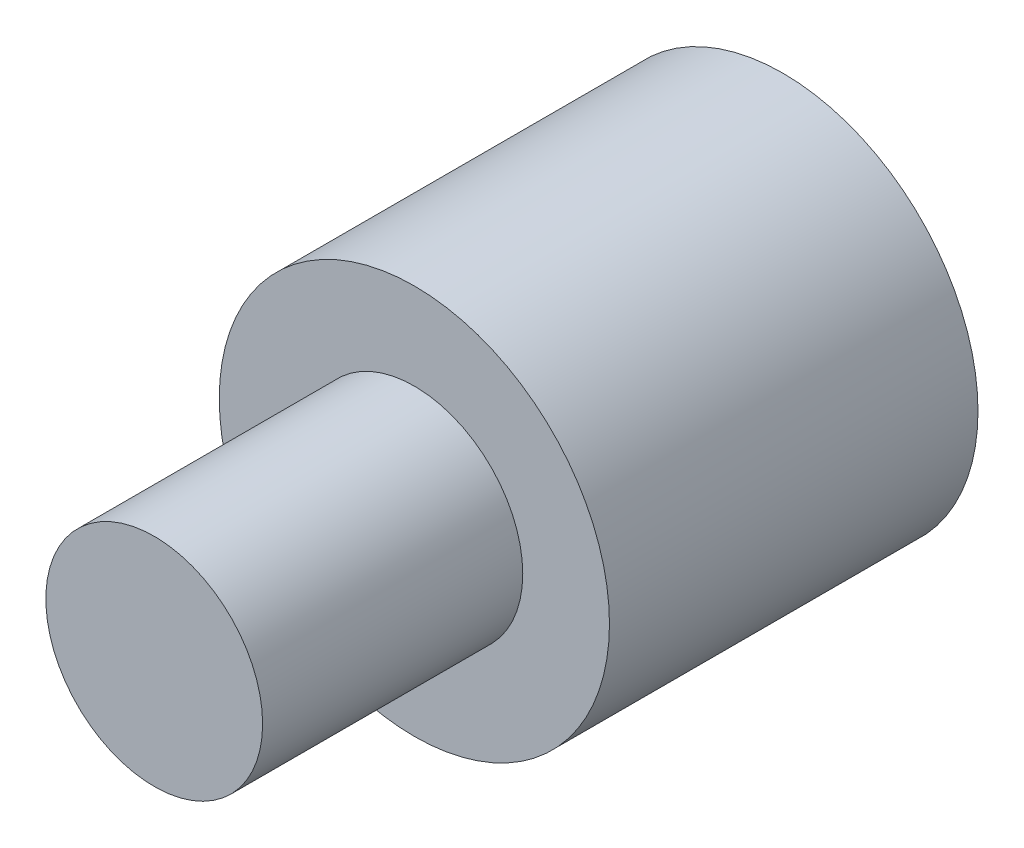
ISO-10303-21;
HEADER;
FILE_DESCRIPTION(('STEP AP214'),'2;1');
FILE_NAME('part.step','',(''),(''),'','','');
FILE_SCHEMA(('AUTOMOTIVE_DESIGN { 1 0 10303 214 1 1 1 1 }'));
ENDSEC;
DATA;
#1=APPLICATION_CONTEXT('core data for automotive mechanical design processes');
#2=APPLICATION_PROTOCOL_DEFINITION('international standard','automotive_design',2000,#1);
#3=PRODUCT_CONTEXT('',#1,'mechanical');
#4=PRODUCT('Part','Part','',(#3));
#5=PRODUCT_RELATED_PRODUCT_CATEGORY('part','',(#4));
#6=PRODUCT_DEFINITION_FORMATION('','',#4);
#7=PRODUCT_DEFINITION_CONTEXT('part definition',#1,'design');
#8=PRODUCT_DEFINITION('design','',#6,#7);
#9=PRODUCT_DEFINITION_SHAPE('','',#8);
#10=(LENGTH_UNIT() NAMED_UNIT(*) SI_UNIT(.MILLI.,.METRE.));
#11=(NAMED_UNIT(*) PLANE_ANGLE_UNIT() SI_UNIT($,.RADIAN.));
#12=(NAMED_UNIT(*) SI_UNIT($,.STERADIAN.) SOLID_ANGLE_UNIT());
#13=UNCERTAINTY_MEASURE_WITH_UNIT(LENGTH_MEASURE(1.E-05),#10,'distance_accuracy_value','');
#14=(GEOMETRIC_REPRESENTATION_CONTEXT(3) GLOBAL_UNCERTAINTY_ASSIGNED_CONTEXT((#13)) GLOBAL_UNIT_ASSIGNED_CONTEXT((#10,
#11,#12)) REPRESENTATION_CONTEXT('',''));
#15=CARTESIAN_POINT('',(0.,0.,0.));
#16=DIRECTION('',(0.,0.,1.));
#17=DIRECTION('',(1.,0.,0.));
#18=AXIS2_PLACEMENT_3D('',#15,#16,#17);
#19=CARTESIAN_POINT('',(0.,0.,17.));
#20=DIRECTION('',(0.,0.,-1.));
#21=DIRECTION('',(-1.,0.,0.));
#22=AXIS2_PLACEMENT_3D('',#19,#20,#21);
#23=CYLINDRICAL_SURFACE('',#22,9.);
#24=CARTESIAN_POINT('',(0.,0.,17.));
#25=DIRECTION('',(0.,0.,1.));
#26=DIRECTION('',(1.,0.,0.));
#27=AXIS2_PLACEMENT_3D('',#24,#25,#26);
#28=CIRCLE('',#27,9.);
#29=CARTESIAN_POINT('',(9.,0.,17.));
#30=VERTEX_POINT('',#29);
#31=EDGE_CURVE('E39',#30,#30,#28,.T.);
#32=ORIENTED_EDGE('',*,*,#31,.F.);
#33=EDGE_LOOP('',(#32));
#34=FACE_BOUND('',#33,.T.);
#35=CARTESIAN_POINT('',(0.,0.,0.));
#36=DIRECTION('',(0.,0.,1.));
#37=DIRECTION('',(1.,0.,0.));
#38=AXIS2_PLACEMENT_3D('',#35,#36,#37);
#39=CIRCLE('',#38,9.);
#40=CARTESIAN_POINT('',(9.,0.,0.));
#41=VERTEX_POINT('',#40);
#42=EDGE_CURVE('E35',#41,#41,#39,.T.);
#43=ORIENTED_EDGE('',*,*,#42,.T.);
#44=EDGE_LOOP('',(#43));
#45=FACE_BOUND('',#44,.T.);
#46=ADVANCED_FACE('F32',(#34,#45),#23,.T.);
#47=CARTESIAN_POINT('',(0.,0.,17.));
#48=DIRECTION('',(0.,0.,1.));
#49=DIRECTION('',(1.,0.,0.));
#50=AXIS2_PLACEMENT_3D('',#47,#48,#49);
#51=PLANE('',#50);
#52=CARTESIAN_POINT('',(0.,0.,17.));
#53=DIRECTION('',(0.,0.,1.));
#54=DIRECTION('',(1.,0.,0.));
#55=AXIS2_PLACEMENT_3D('',#52,#53,#54);
#56=CIRCLE('',#55,5.);
#57=CARTESIAN_POINT('',(5.,0.,17.));
#58=VERTEX_POINT('',#57);
#59=EDGE_CURVE('E10',#58,#58,#56,.T.);
#60=ORIENTED_EDGE('',*,*,#59,.F.);
#61=EDGE_LOOP('',(#60));
#62=FACE_BOUND('',#61,.T.);
#63=ORIENTED_EDGE('',*,*,#31,.T.);
#64=EDGE_LOOP('',(#63));
#65=FACE_BOUND('',#64,.T.);
#66=ADVANCED_FACE('F56',(#62,#65),#51,.T.);
#67=CARTESIAN_POINT('',(0.,0.,0.));
#68=DIRECTION('',(0.,0.,1.));
#69=DIRECTION('',(1.,0.,0.));
#70=AXIS2_PLACEMENT_3D('',#67,#68,#69);
#71=PLANE('',#70);
#72=ORIENTED_EDGE('',*,*,#42,.F.);
#73=EDGE_LOOP('',(#72));
#74=FACE_BOUND('',#73,.T.);
#75=ADVANCED_FACE('F53',(#74),#71,.F.);
#76=CARTESIAN_POINT('',(0.,0.,29.));
#77=DIRECTION('',(0.,0.,-1.));
#78=DIRECTION('',(-1.,0.,0.));
#79=AXIS2_PLACEMENT_3D('',#76,#77,#78);
#80=CYLINDRICAL_SURFACE('',#79,5.);
#81=CARTESIAN_POINT('',(0.,0.,29.));
#82=DIRECTION('',(0.,0.,1.));
#83=DIRECTION('',(1.,0.,0.));
#84=AXIS2_PLACEMENT_3D('',#81,#82,#83);
#85=CIRCLE('',#84,5.);
#86=CARTESIAN_POINT('',(5.,0.,29.));
#87=VERTEX_POINT('',#86);
#88=EDGE_CURVE('E45',#87,#87,#85,.T.);
#89=ORIENTED_EDGE('',*,*,#88,.F.);
#90=EDGE_LOOP('',(#89));
#91=FACE_BOUND('',#90,.T.);
#92=ORIENTED_EDGE('',*,*,#59,.T.);
#93=EDGE_LOOP('',(#92));
#94=FACE_BOUND('',#93,.T.);
#95=ADVANCED_FACE('F55',(#91,#94),#80,.T.);
#96=CARTESIAN_POINT('',(0.,0.,29.));
#97=DIRECTION('',(0.,0.,1.));
#98=DIRECTION('',(1.,0.,0.));
#99=AXIS2_PLACEMENT_3D('',#96,#97,#98);
#100=PLANE('',#99);
#101=ORIENTED_EDGE('',*,*,#88,.T.);
#102=EDGE_LOOP('',(#101));
#103=FACE_BOUND('',#102,.T.);
#104=ADVANCED_FACE('F61',(#103),#100,.T.);
#105=CLOSED_SHELL('',(#46,#66,#75,#95,#104));
#106=MANIFOLD_SOLID_BREP('B2',#105);
#107=ADVANCED_BREP_SHAPE_REPRESENTATION('',(#18,#106),#14);
#108=SHAPE_DEFINITION_REPRESENTATION(#9,#107);
ENDSEC;
END-ISO-10303-21;
